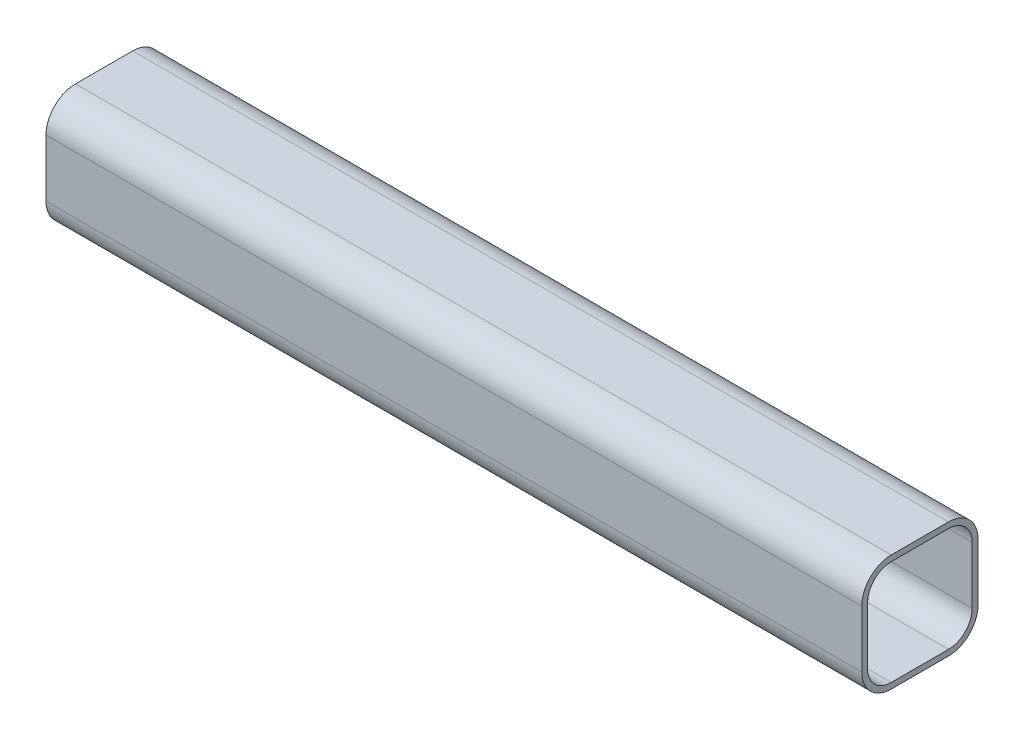
ISO-10303-21;
HEADER;
FILE_DESCRIPTION(('STEP AP214'),'2;1');
FILE_NAME('part.step','',(''),(''),'','','');
FILE_SCHEMA(('AUTOMOTIVE_DESIGN { 1 0 10303 214 1 1 1 1 }'));
ENDSEC;
DATA;
#1=APPLICATION_CONTEXT('core data for automotive mechanical design processes');
#2=APPLICATION_PROTOCOL_DEFINITION('international standard','automotive_design',2000,#1);
#3=PRODUCT_CONTEXT('',#1,'mechanical');
#4=PRODUCT('Part','Part','',(#3));
#5=PRODUCT_RELATED_PRODUCT_CATEGORY('part','',(#4));
#6=PRODUCT_DEFINITION_FORMATION('','',#4);
#7=PRODUCT_DEFINITION_CONTEXT('part definition',#1,'design');
#8=PRODUCT_DEFINITION('design','',#6,#7);
#9=PRODUCT_DEFINITION_SHAPE('','',#8);
#10=(LENGTH_UNIT() NAMED_UNIT(*) SI_UNIT(.MILLI.,.METRE.));
#11=(NAMED_UNIT(*) PLANE_ANGLE_UNIT() SI_UNIT($,.RADIAN.));
#12=(NAMED_UNIT(*) SI_UNIT($,.STERADIAN.) SOLID_ANGLE_UNIT());
#13=UNCERTAINTY_MEASURE_WITH_UNIT(LENGTH_MEASURE(1.E-05),#10,'distance_accuracy_value','');
#14=(GEOMETRIC_REPRESENTATION_CONTEXT(3) GLOBAL_UNCERTAINTY_ASSIGNED_CONTEXT((#13)) GLOBAL_UNIT_ASSIGNED_CONTEXT((#10,
#11,#12)) REPRESENTATION_CONTEXT('',''));
#15=CARTESIAN_POINT('',(0.,0.,0.));
#16=DIRECTION('',(0.,0.,1.));
#17=DIRECTION('',(1.,0.,0.));
#18=AXIS2_PLACEMENT_3D('',#15,#16,#17);
#19=CARTESIAN_POINT('',(214.786165341652,12.3,12.3));
#20=DIRECTION('',(-1.,0.,0.));
#21=DIRECTION('',(0.,0.,1.));
#22=AXIS2_PLACEMENT_3D('',#19,#20,#21);
#23=CYLINDRICAL_SURFACE('',#22,12.7);
#24=CARTESIAN_POINT('',(-136.213834658348,12.3,12.3));
#25=DIRECTION('',(1.,0.,0.));
#26=DIRECTION('',(0.,0.,-1.));
#27=AXIS2_PLACEMENT_3D('',#24,#25,#26);
#28=CIRCLE('',#27,12.7);
#29=CARTESIAN_POINT('',(-136.213834658348,25.,12.3));
#30=VERTEX_POINT('',#29);
#31=CARTESIAN_POINT('',(-136.213834658348,12.3,25.));
#32=VERTEX_POINT('',#31);
#33=EDGE_CURVE('E236',#30,#32,#28,.T.);
#34=ORIENTED_EDGE('',*,*,#33,.T.);
#35=DIRECTION('',(-1.,0.,0.));
#36=VECTOR('',#35,1.);
#37=CARTESIAN_POINT('',(214.786165341652,12.3,25.));
#38=LINE('',#37,#36);
#39=CARTESIAN_POINT('',(214.786165341652,12.3,25.));
#40=VERTEX_POINT('',#39);
#41=EDGE_CURVE('E12',#40,#32,#38,.T.);
#42=ORIENTED_EDGE('',*,*,#41,.F.);
#43=CARTESIAN_POINT('',(214.786165341652,12.3,12.3));
#44=DIRECTION('',(1.,0.,0.));
#45=DIRECTION('',(0.,0.,-1.));
#46=AXIS2_PLACEMENT_3D('',#43,#44,#45);
#47=CIRCLE('',#46,12.7);
#48=CARTESIAN_POINT('',(214.786165341652,25.,12.3));
#49=VERTEX_POINT('',#48);
#50=EDGE_CURVE('E314',#49,#40,#47,.T.);
#51=ORIENTED_EDGE('',*,*,#50,.F.);
#52=DIRECTION('',(-1.,0.,0.));
#53=VECTOR('',#52,1.);
#54=CARTESIAN_POINT('',(214.786165341652,25.,12.3));
#55=LINE('',#54,#53);
#56=EDGE_CURVE('E251',#49,#30,#55,.T.);
#57=ORIENTED_EDGE('',*,*,#56,.T.);
#58=EDGE_LOOP('',(#34,#42,#51,#57));
#59=FACE_BOUND('',#58,.T.);
#60=ADVANCED_FACE('F64',(#59),#23,.T.);
#61=CARTESIAN_POINT('',(214.786165341652,12.3,25.));
#62=DIRECTION('',(0.,0.,-1.));
#63=DIRECTION('',(-1.,0.,0.));
#64=AXIS2_PLACEMENT_3D('',#61,#62,#63);
#65=PLANE('',#64);
#66=DIRECTION('',(0.,-1.,0.));
#67=VECTOR('',#66,1.);
#68=CARTESIAN_POINT('',(-136.213834658348,12.3,25.));
#69=LINE('',#68,#67);
#70=CARTESIAN_POINT('',(-136.213834658348,-12.3,25.));
#71=VERTEX_POINT('',#70);
#72=EDGE_CURVE('E239',#32,#71,#69,.T.);
#73=ORIENTED_EDGE('',*,*,#72,.T.);
#74=DIRECTION('',(-1.,0.,0.));
#75=VECTOR('',#74,1.);
#76=CARTESIAN_POINT('',(214.786165341652,-12.3,25.));
#77=LINE('',#76,#75);
#78=CARTESIAN_POINT('',(214.786165341652,-12.3,25.));
#79=VERTEX_POINT('',#78);
#80=EDGE_CURVE('E74',#79,#71,#77,.T.);
#81=ORIENTED_EDGE('',*,*,#80,.F.);
#82=DIRECTION('',(0.,-1.,0.));
#83=VECTOR('',#82,1.);
#84=CARTESIAN_POINT('',(214.786165341652,12.3,25.));
#85=LINE('',#84,#83);
#86=EDGE_CURVE('E316',#40,#79,#85,.T.);
#87=ORIENTED_EDGE('',*,*,#86,.F.);
#88=ORIENTED_EDGE('',*,*,#41,.T.);
#89=EDGE_LOOP('',(#73,#81,#87,#88));
#90=FACE_BOUND('',#89,.T.);
#91=ADVANCED_FACE('F351',(#90),#65,.F.);
#92=CARTESIAN_POINT('',(214.786165341652,-12.3,12.3));
#93=DIRECTION('',(-1.,0.,0.));
#94=DIRECTION('',(0.,0.,1.));
#95=AXIS2_PLACEMENT_3D('',#92,#93,#94);
#96=CYLINDRICAL_SURFACE('',#95,12.7);
#97=CARTESIAN_POINT('',(-136.213834658348,-12.3,12.3));
#98=DIRECTION('',(1.,0.,0.));
#99=DIRECTION('',(0.,0.,-1.));
#100=AXIS2_PLACEMENT_3D('',#97,#98,#99);
#101=CIRCLE('',#100,12.7);
#102=CARTESIAN_POINT('',(-136.213834658348,-25.,12.3));
#103=VERTEX_POINT('',#102);
#104=EDGE_CURVE('E241',#71,#103,#101,.T.);
#105=ORIENTED_EDGE('',*,*,#104,.T.);
#106=DIRECTION('',(-1.,0.,0.));
#107=VECTOR('',#106,1.);
#108=CARTESIAN_POINT('',(214.786165341652,-25.,12.3));
#109=LINE('',#108,#107);
#110=CARTESIAN_POINT('',(214.786165341652,-25.,12.3));
#111=VERTEX_POINT('',#110);
#112=EDGE_CURVE('E258',#111,#103,#109,.T.);
#113=ORIENTED_EDGE('',*,*,#112,.F.);
#114=CARTESIAN_POINT('',(214.786165341652,-12.3,12.3));
#115=DIRECTION('',(1.,0.,0.));
#116=DIRECTION('',(0.,0.,-1.));
#117=AXIS2_PLACEMENT_3D('',#114,#115,#116);
#118=CIRCLE('',#117,12.7);
#119=EDGE_CURVE('E318',#79,#111,#118,.T.);
#120=ORIENTED_EDGE('',*,*,#119,.F.);
#121=ORIENTED_EDGE('',*,*,#80,.T.);
#122=EDGE_LOOP('',(#105,#113,#120,#121));
#123=FACE_BOUND('',#122,.T.);
#124=ADVANCED_FACE('F356',(#123),#96,.T.);
#125=CARTESIAN_POINT('',(214.786165341652,-25.,-12.3));
#126=DIRECTION('',(0.,1.,0.));
#127=DIRECTION('',(0.,0.,1.));
#128=AXIS2_PLACEMENT_3D('',#125,#126,#127);
#129=PLANE('',#128);
#130=DIRECTION('',(0.,0.,-1.));
#131=VECTOR('',#130,1.);
#132=CARTESIAN_POINT('',(-136.213834658348,-25.,-12.3));
#133=LINE('',#132,#131);
#134=CARTESIAN_POINT('',(-136.213834658348,-25.,-12.3));
#135=VERTEX_POINT('',#134);
#136=EDGE_CURVE('E243',#103,#135,#133,.T.);
#137=ORIENTED_EDGE('',*,*,#136,.T.);
#138=DIRECTION('',(-1.,0.,0.));
#139=VECTOR('',#138,1.);
#140=CARTESIAN_POINT('',(214.786165341652,-25.,-12.3));
#141=LINE('',#140,#139);
#142=CARTESIAN_POINT('',(214.786165341652,-25.,-12.3));
#143=VERTEX_POINT('',#142);
#144=EDGE_CURVE('E255',#143,#135,#141,.T.);
#145=ORIENTED_EDGE('',*,*,#144,.F.);
#146=DIRECTION('',(0.,0.,-1.));
#147=VECTOR('',#146,1.);
#148=CARTESIAN_POINT('',(214.786165341652,-25.,-12.3));
#149=LINE('',#148,#147);
#150=EDGE_CURVE('E320',#111,#143,#149,.T.);
#151=ORIENTED_EDGE('',*,*,#150,.F.);
#152=ORIENTED_EDGE('',*,*,#112,.T.);
#153=EDGE_LOOP('',(#137,#145,#151,#152));
#154=FACE_BOUND('',#153,.T.);
#155=ADVANCED_FACE('F326',(#154),#129,.F.);
#156=CARTESIAN_POINT('',(214.786165341652,-12.3,-12.3));
#157=DIRECTION('',(-1.,0.,0.));
#158=DIRECTION('',(0.,0.,1.));
#159=AXIS2_PLACEMENT_3D('',#156,#157,#158);
#160=CYLINDRICAL_SURFACE('',#159,12.7);
#161=CARTESIAN_POINT('',(-136.213834658348,-12.3,-12.3));
#162=DIRECTION('',(1.,0.,0.));
#163=DIRECTION('',(0.,0.,-1.));
#164=AXIS2_PLACEMENT_3D('',#161,#162,#163);
#165=CIRCLE('',#164,12.7);
#166=CARTESIAN_POINT('',(-136.213834658348,-12.3,-25.));
#167=VERTEX_POINT('',#166);
#168=EDGE_CURVE('E245',#135,#167,#165,.T.);
#169=ORIENTED_EDGE('',*,*,#168,.T.);
#170=DIRECTION('',(-1.,0.,0.));
#171=VECTOR('',#170,1.);
#172=CARTESIAN_POINT('',(214.786165341652,-12.3,-25.));
#173=LINE('',#172,#171);
#174=CARTESIAN_POINT('',(214.786165341652,-12.3,-25.));
#175=VERTEX_POINT('',#174);
#176=EDGE_CURVE('E203',#175,#167,#173,.T.);
#177=ORIENTED_EDGE('',*,*,#176,.F.);
#178=CARTESIAN_POINT('',(214.786165341652,-12.3,-12.3));
#179=DIRECTION('',(1.,0.,0.));
#180=DIRECTION('',(0.,0.,-1.));
#181=AXIS2_PLACEMENT_3D('',#178,#179,#180);
#182=CIRCLE('',#181,12.7);
#183=EDGE_CURVE('E194',#143,#175,#182,.T.);
#184=ORIENTED_EDGE('',*,*,#183,.F.);
#185=ORIENTED_EDGE('',*,*,#144,.T.);
#186=EDGE_LOOP('',(#169,#177,#184,#185));
#187=FACE_BOUND('',#186,.T.);
#188=ADVANCED_FACE('F330',(#187),#160,.T.);
#189=CARTESIAN_POINT('',(214.786165341652,-12.3,-25.));
#190=DIRECTION('',(0.,0.,1.));
#191=DIRECTION('',(1.,0.,0.));
#192=AXIS2_PLACEMENT_3D('',#189,#190,#191);
#193=PLANE('',#192);
#194=DIRECTION('',(0.,1.,0.));
#195=VECTOR('',#194,1.);
#196=CARTESIAN_POINT('',(-136.213834658348,-12.3,-25.));
#197=LINE('',#196,#195);
#198=CARTESIAN_POINT('',(-136.213834658348,12.3,-25.));
#199=VERTEX_POINT('',#198);
#200=EDGE_CURVE('E202',#167,#199,#197,.T.);
#201=ORIENTED_EDGE('',*,*,#200,.T.);
#202=DIRECTION('',(-1.,0.,0.));
#203=VECTOR('',#202,1.);
#204=CARTESIAN_POINT('',(214.786165341652,12.3,-25.));
#205=LINE('',#204,#203);
#206=CARTESIAN_POINT('',(214.786165341652,12.3,-25.));
#207=VERTEX_POINT('',#206);
#208=EDGE_CURVE('E199',#207,#199,#205,.T.);
#209=ORIENTED_EDGE('',*,*,#208,.F.);
#210=DIRECTION('',(0.,1.,0.));
#211=VECTOR('',#210,1.);
#212=CARTESIAN_POINT('',(214.786165341652,-12.3,-25.));
#213=LINE('',#212,#211);
#214=EDGE_CURVE('E188',#175,#207,#213,.T.);
#215=ORIENTED_EDGE('',*,*,#214,.F.);
#216=ORIENTED_EDGE('',*,*,#176,.T.);
#217=EDGE_LOOP('',(#201,#209,#215,#216));
#218=FACE_BOUND('',#217,.T.);
#219=ADVANCED_FACE('F200',(#218),#193,.F.);
#220=CARTESIAN_POINT('',(214.786165341652,12.3,-12.3));
#221=DIRECTION('',(-1.,0.,0.));
#222=DIRECTION('',(0.,0.,1.));
#223=AXIS2_PLACEMENT_3D('',#220,#221,#222);
#224=CYLINDRICAL_SURFACE('',#223,12.7);
#225=CARTESIAN_POINT('',(-136.213834658348,12.3,-12.3));
#226=DIRECTION('',(1.,0.,0.));
#227=DIRECTION('',(0.,0.,-1.));
#228=AXIS2_PLACEMENT_3D('',#225,#226,#227);
#229=CIRCLE('',#228,12.7);
#230=CARTESIAN_POINT('',(-136.213834658348,25.,-12.3));
#231=VERTEX_POINT('',#230);
#232=EDGE_CURVE('E136',#199,#231,#229,.T.);
#233=ORIENTED_EDGE('',*,*,#232,.T.);
#234=DIRECTION('',(-1.,0.,0.));
#235=VECTOR('',#234,1.);
#236=CARTESIAN_POINT('',(214.786165341652,25.,-12.3));
#237=LINE('',#236,#235);
#238=CARTESIAN_POINT('',(214.786165341652,25.,-12.3));
#239=VERTEX_POINT('',#238);
#240=EDGE_CURVE('E204',#239,#231,#237,.T.);
#241=ORIENTED_EDGE('',*,*,#240,.F.);
#242=CARTESIAN_POINT('',(214.786165341652,12.3,-12.3));
#243=DIRECTION('',(1.,0.,0.));
#244=DIRECTION('',(0.,0.,-1.));
#245=AXIS2_PLACEMENT_3D('',#242,#243,#244);
#246=CIRCLE('',#245,12.7);
#247=EDGE_CURVE('E192',#207,#239,#246,.T.);
#248=ORIENTED_EDGE('',*,*,#247,.F.);
#249=ORIENTED_EDGE('',*,*,#208,.T.);
#250=EDGE_LOOP('',(#233,#241,#248,#249));
#251=FACE_BOUND('',#250,.T.);
#252=ADVANCED_FACE('F206',(#251),#224,.T.);
#253=CARTESIAN_POINT('',(214.786165341652,-12.3,12.3));
#254=DIRECTION('',(-1.,0.,0.));
#255=DIRECTION('',(0.,0.,1.));
#256=AXIS2_PLACEMENT_3D('',#253,#254,#255);
#257=CYLINDRICAL_SURFACE('',#256,10.2);
#258=CARTESIAN_POINT('',(-136.213834658348,-12.3,12.3));
#259=DIRECTION('',(1.,0.,0.));
#260=DIRECTION('',(0.,0.,-1.));
#261=AXIS2_PLACEMENT_3D('',#258,#259,#260);
#262=CIRCLE('',#261,10.2);
#263=CARTESIAN_POINT('',(-136.213834658348,-12.3,22.5));
#264=VERTEX_POINT('',#263);
#265=CARTESIAN_POINT('',(-136.213834658348,-22.5,12.3));
#266=VERTEX_POINT('',#265);
#267=EDGE_CURVE('E212',#264,#266,#262,.T.);
#268=ORIENTED_EDGE('',*,*,#267,.F.);
#269=DIRECTION('',(-1.,0.,0.));
#270=VECTOR('',#269,1.);
#271=CARTESIAN_POINT('',(214.786165341652,-12.3,22.5));
#272=LINE('',#271,#270);
#273=CARTESIAN_POINT('',(214.786165341652,-12.3,22.5));
#274=VERTEX_POINT('',#273);
#275=EDGE_CURVE('E68',#274,#264,#272,.T.);
#276=ORIENTED_EDGE('',*,*,#275,.F.);
#277=CARTESIAN_POINT('',(214.786165341652,-12.3,12.3));
#278=DIRECTION('',(1.,0.,0.));
#279=DIRECTION('',(0.,0.,-1.));
#280=AXIS2_PLACEMENT_3D('',#277,#278,#279);
#281=CIRCLE('',#280,10.2);
#282=CARTESIAN_POINT('',(214.786165341652,-22.5,12.3));
#283=VERTEX_POINT('',#282);
#284=EDGE_CURVE('E250',#274,#283,#281,.T.);
#285=ORIENTED_EDGE('',*,*,#284,.T.);
#286=DIRECTION('',(-1.,0.,0.));
#287=VECTOR('',#286,1.);
#288=CARTESIAN_POINT('',(214.786165341652,-22.5,12.3));
#289=LINE('',#288,#287);
#290=EDGE_CURVE('E208',#283,#266,#289,.T.);
#291=ORIENTED_EDGE('',*,*,#290,.T.);
#292=EDGE_LOOP('',(#268,#276,#285,#291));
#293=FACE_BOUND('',#292,.T.);
#294=ADVANCED_FACE('F66',(#293),#257,.F.);
#295=CARTESIAN_POINT('',(214.786165341652,12.3,22.5));
#296=DIRECTION('',(0.,0.,-1.));
#297=DIRECTION('',(-1.,0.,0.));
#298=AXIS2_PLACEMENT_3D('',#295,#296,#297);
#299=PLANE('',#298);
#300=DIRECTION('',(0.,-1.,0.));
#301=VECTOR('',#300,1.);
#302=CARTESIAN_POINT('',(-136.213834658348,12.3,22.5));
#303=LINE('',#302,#301);
#304=CARTESIAN_POINT('',(-136.213834658348,12.3,22.5));
#305=VERTEX_POINT('',#304);
#306=EDGE_CURVE('E215',#305,#264,#303,.T.);
#307=ORIENTED_EDGE('',*,*,#306,.F.);
#308=DIRECTION('',(-1.,0.,0.));
#309=VECTOR('',#308,1.);
#310=CARTESIAN_POINT('',(214.786165341652,12.3,22.5));
#311=LINE('',#310,#309);
#312=CARTESIAN_POINT('',(214.786165341652,12.3,22.5));
#313=VERTEX_POINT('',#312);
#314=EDGE_CURVE('E273',#313,#305,#311,.T.);
#315=ORIENTED_EDGE('',*,*,#314,.F.);
#316=DIRECTION('',(0.,-1.,0.));
#317=VECTOR('',#316,1.);
#318=CARTESIAN_POINT('',(214.786165341652,12.3,22.5));
#319=LINE('',#318,#317);
#320=EDGE_CURVE('E282',#313,#274,#319,.T.);
#321=ORIENTED_EDGE('',*,*,#320,.T.);
#322=ORIENTED_EDGE('',*,*,#275,.T.);
#323=EDGE_LOOP('',(#307,#315,#321,#322));
#324=FACE_BOUND('',#323,.T.);
#325=ADVANCED_FACE('F280',(#324),#299,.T.);
#326=CARTESIAN_POINT('',(214.786165341652,12.3,12.3));
#327=DIRECTION('',(-1.,0.,0.));
#328=DIRECTION('',(0.,0.,1.));
#329=AXIS2_PLACEMENT_3D('',#326,#327,#328);
#330=CYLINDRICAL_SURFACE('',#329,10.2);
#331=CARTESIAN_POINT('',(-136.213834658348,12.3,12.3));
#332=DIRECTION('',(1.,0.,0.));
#333=DIRECTION('',(0.,0.,-1.));
#334=AXIS2_PLACEMENT_3D('',#331,#332,#333);
#335=CIRCLE('',#334,10.2);
#336=CARTESIAN_POINT('',(-136.213834658348,22.5,12.3));
#337=VERTEX_POINT('',#336);
#338=EDGE_CURVE('E218',#337,#305,#335,.T.);
#339=ORIENTED_EDGE('',*,*,#338,.F.);
#340=DIRECTION('',(-1.,0.,0.));
#341=VECTOR('',#340,1.);
#342=CARTESIAN_POINT('',(214.786165341652,22.5,12.3));
#343=LINE('',#342,#341);
#344=CARTESIAN_POINT('',(214.786165341652,22.5,12.3));
#345=VERTEX_POINT('',#344);
#346=EDGE_CURVE('E272',#345,#337,#343,.T.);
#347=ORIENTED_EDGE('',*,*,#346,.F.);
#348=CARTESIAN_POINT('',(214.786165341652,12.3,12.3));
#349=DIRECTION('',(1.,0.,0.));
#350=DIRECTION('',(0.,0.,-1.));
#351=AXIS2_PLACEMENT_3D('',#348,#349,#350);
#352=CIRCLE('',#351,10.2);
#353=EDGE_CURVE('E290',#345,#313,#352,.T.);
#354=ORIENTED_EDGE('',*,*,#353,.T.);
#355=ORIENTED_EDGE('',*,*,#314,.T.);
#356=EDGE_LOOP('',(#339,#347,#354,#355));
#357=FACE_BOUND('',#356,.T.);
#358=ADVANCED_FACE('F288',(#357),#330,.F.);
#359=CARTESIAN_POINT('',(214.786165341652,22.5,12.3));
#360=DIRECTION('',(0.,-1.,0.));
#361=DIRECTION('',(0.,0.,-1.));
#362=AXIS2_PLACEMENT_3D('',#359,#360,#361);
#363=PLANE('',#362);
#364=DIRECTION('',(0.,0.,1.));
#365=VECTOR('',#364,1.);
#366=CARTESIAN_POINT('',(-136.213834658348,22.5,12.3));
#367=LINE('',#366,#365);
#368=CARTESIAN_POINT('',(-136.213834658348,22.5,-12.3));
#369=VERTEX_POINT('',#368);
#370=EDGE_CURVE('E221',#369,#337,#367,.T.);
#371=ORIENTED_EDGE('',*,*,#370,.F.);
#372=DIRECTION('',(-1.,0.,0.));
#373=VECTOR('',#372,1.);
#374=CARTESIAN_POINT('',(214.786165341652,22.5,-12.3));
#375=LINE('',#374,#373);
#376=CARTESIAN_POINT('',(214.786165341652,22.5,-12.3));
#377=VERTEX_POINT('',#376);
#378=EDGE_CURVE('E270',#377,#369,#375,.T.);
#379=ORIENTED_EDGE('',*,*,#378,.F.);
#380=DIRECTION('',(0.,0.,1.));
#381=VECTOR('',#380,1.);
#382=CARTESIAN_POINT('',(214.786165341652,22.5,12.3));
#383=LINE('',#382,#381);
#384=EDGE_CURVE('E296',#377,#345,#383,.T.);
#385=ORIENTED_EDGE('',*,*,#384,.T.);
#386=ORIENTED_EDGE('',*,*,#346,.T.);
#387=EDGE_LOOP('',(#371,#379,#385,#386));
#388=FACE_BOUND('',#387,.T.);
#389=ADVANCED_FACE('F299',(#388),#363,.T.);
#390=CARTESIAN_POINT('',(214.786165341652,12.3,-12.3));
#391=DIRECTION('',(-1.,0.,0.));
#392=DIRECTION('',(0.,0.,1.));
#393=AXIS2_PLACEMENT_3D('',#390,#391,#392);
#394=CYLINDRICAL_SURFACE('',#393,10.2);
#395=CARTESIAN_POINT('',(-136.213834658348,12.3,-12.3));
#396=DIRECTION('',(1.,0.,0.));
#397=DIRECTION('',(0.,0.,-1.));
#398=AXIS2_PLACEMENT_3D('',#395,#396,#397);
#399=CIRCLE('',#398,10.2);
#400=CARTESIAN_POINT('',(-136.213834658348,12.3,-22.5));
#401=VERTEX_POINT('',#400);
#402=EDGE_CURVE('E224',#401,#369,#399,.T.);
#403=ORIENTED_EDGE('',*,*,#402,.F.);
#404=DIRECTION('',(-1.,0.,0.));
#405=VECTOR('',#404,1.);
#406=CARTESIAN_POINT('',(214.786165341652,12.3,-22.5));
#407=LINE('',#406,#405);
#408=CARTESIAN_POINT('',(214.786165341652,12.3,-22.5));
#409=VERTEX_POINT('',#408);
#410=EDGE_CURVE('E268',#409,#401,#407,.T.);
#411=ORIENTED_EDGE('',*,*,#410,.F.);
#412=CARTESIAN_POINT('',(214.786165341652,12.3,-12.3));
#413=DIRECTION('',(1.,0.,0.));
#414=DIRECTION('',(0.,0.,-1.));
#415=AXIS2_PLACEMENT_3D('',#412,#413,#414);
#416=CIRCLE('',#415,10.2);
#417=EDGE_CURVE('E300',#409,#377,#416,.T.);
#418=ORIENTED_EDGE('',*,*,#417,.T.);
#419=ORIENTED_EDGE('',*,*,#378,.T.);
#420=EDGE_LOOP('',(#403,#411,#418,#419));
#421=FACE_BOUND('',#420,.T.);
#422=ADVANCED_FACE('F367',(#421),#394,.F.);
#423=CARTESIAN_POINT('',(214.786165341652,-12.3,-22.5));
#424=DIRECTION('',(0.,0.,1.));
#425=DIRECTION('',(1.,0.,0.));
#426=AXIS2_PLACEMENT_3D('',#423,#424,#425);
#427=PLANE('',#426);
#428=DIRECTION('',(0.,1.,0.));
#429=VECTOR('',#428,1.);
#430=CARTESIAN_POINT('',(-136.213834658348,-12.3,-22.5));
#431=LINE('',#430,#429);
#432=CARTESIAN_POINT('',(-136.213834658348,-12.3,-22.5));
#433=VERTEX_POINT('',#432);
#434=EDGE_CURVE('E227',#433,#401,#431,.T.);
#435=ORIENTED_EDGE('',*,*,#434,.F.);
#436=DIRECTION('',(-1.,0.,0.));
#437=VECTOR('',#436,1.);
#438=CARTESIAN_POINT('',(214.786165341652,-12.3,-22.5));
#439=LINE('',#438,#437);
#440=CARTESIAN_POINT('',(214.786165341652,-12.3,-22.5));
#441=VERTEX_POINT('',#440);
#442=EDGE_CURVE('E266',#441,#433,#439,.T.);
#443=ORIENTED_EDGE('',*,*,#442,.F.);
#444=DIRECTION('',(0.,1.,0.));
#445=VECTOR('',#444,1.);
#446=CARTESIAN_POINT('',(214.786165341652,-12.3,-22.5));
#447=LINE('',#446,#445);
#448=EDGE_CURVE('E302',#441,#409,#447,.T.);
#449=ORIENTED_EDGE('',*,*,#448,.T.);
#450=ORIENTED_EDGE('',*,*,#410,.T.);
#451=EDGE_LOOP('',(#435,#443,#449,#450));
#452=FACE_BOUND('',#451,.T.);
#453=ADVANCED_FACE('F363',(#452),#427,.T.);
#454=CARTESIAN_POINT('',(214.786165341652,-12.3,-12.3));
#455=DIRECTION('',(-1.,0.,0.));
#456=DIRECTION('',(0.,0.,1.));
#457=AXIS2_PLACEMENT_3D('',#454,#455,#456);
#458=CYLINDRICAL_SURFACE('',#457,10.2);
#459=CARTESIAN_POINT('',(-136.213834658348,-12.3,-12.3));
#460=DIRECTION('',(1.,0.,0.));
#461=DIRECTION('',(0.,0.,-1.));
#462=AXIS2_PLACEMENT_3D('',#459,#460,#461);
#463=CIRCLE('',#462,10.2);
#464=CARTESIAN_POINT('',(-136.213834658348,-22.5,-12.3));
#465=VERTEX_POINT('',#464);
#466=EDGE_CURVE('E230',#465,#433,#463,.T.);
#467=ORIENTED_EDGE('',*,*,#466,.F.);
#468=DIRECTION('',(-1.,0.,0.));
#469=VECTOR('',#468,1.);
#470=CARTESIAN_POINT('',(214.786165341652,-22.5,-12.3));
#471=LINE('',#470,#469);
#472=CARTESIAN_POINT('',(214.786165341652,-22.5,-12.3));
#473=VERTEX_POINT('',#472);
#474=EDGE_CURVE('E264',#473,#465,#471,.T.);
#475=ORIENTED_EDGE('',*,*,#474,.F.);
#476=CARTESIAN_POINT('',(214.786165341652,-12.3,-12.3));
#477=DIRECTION('',(1.,0.,0.));
#478=DIRECTION('',(0.,0.,-1.));
#479=AXIS2_PLACEMENT_3D('',#476,#477,#478);
#480=CIRCLE('',#479,10.2);
#481=EDGE_CURVE('E308',#473,#441,#480,.T.);
#482=ORIENTED_EDGE('',*,*,#481,.T.);
#483=ORIENTED_EDGE('',*,*,#442,.T.);
#484=EDGE_LOOP('',(#467,#475,#482,#483));
#485=FACE_BOUND('',#484,.T.);
#486=ADVANCED_FACE('F345',(#485),#458,.F.);
#487=CARTESIAN_POINT('',(214.786165341652,-22.5,-12.3));
#488=DIRECTION('',(0.,1.,0.));
#489=DIRECTION('',(0.,0.,1.));
#490=AXIS2_PLACEMENT_3D('',#487,#488,#489);
#491=PLANE('',#490);
#492=DIRECTION('',(0.,0.,-1.));
#493=VECTOR('',#492,1.);
#494=CARTESIAN_POINT('',(-136.213834658348,-22.5,-12.3));
#495=LINE('',#494,#493);
#496=EDGE_CURVE('E233',#266,#465,#495,.T.);
#497=ORIENTED_EDGE('',*,*,#496,.F.);
#498=ORIENTED_EDGE('',*,*,#290,.F.);
#499=DIRECTION('',(0.,0.,-1.));
#500=VECTOR('',#499,1.);
#501=CARTESIAN_POINT('',(214.786165341652,-22.5,-12.3));
#502=LINE('',#501,#500);
#503=EDGE_CURVE('E311',#283,#473,#502,.T.);
#504=ORIENTED_EDGE('',*,*,#503,.T.);
#505=ORIENTED_EDGE('',*,*,#474,.T.);
#506=EDGE_LOOP('',(#497,#498,#504,#505));
#507=FACE_BOUND('',#506,.T.);
#508=ADVANCED_FACE('F338',(#507),#491,.T.);
#509=CARTESIAN_POINT('',(214.786165341652,25.,12.3));
#510=DIRECTION('',(0.,-1.,0.));
#511=DIRECTION('',(0.,0.,-1.));
#512=AXIS2_PLACEMENT_3D('',#509,#510,#511);
#513=PLANE('',#512);
#514=DIRECTION('',(0.,0.,1.));
#515=VECTOR('',#514,1.);
#516=CARTESIAN_POINT('',(-136.213834658348,25.,12.3));
#517=LINE('',#516,#515);
#518=EDGE_CURVE('E142',#231,#30,#517,.T.);
#519=ORIENTED_EDGE('',*,*,#518,.T.);
#520=ORIENTED_EDGE('',*,*,#56,.F.);
#521=DIRECTION('',(0.,0.,1.));
#522=VECTOR('',#521,1.);
#523=CARTESIAN_POINT('',(214.786165341652,25.,12.3));
#524=LINE('',#523,#522);
#525=EDGE_CURVE('E83',#239,#49,#524,.T.);
#526=ORIENTED_EDGE('',*,*,#525,.F.);
#527=ORIENTED_EDGE('',*,*,#240,.T.);
#528=EDGE_LOOP('',(#519,#520,#526,#527));
#529=FACE_BOUND('',#528,.T.);
#530=ADVANCED_FACE('F336',(#529),#513,.F.);
#531=CARTESIAN_POINT('',(214.786165341652,12.3,12.3));
#532=DIRECTION('',(1.,0.,0.));
#533=DIRECTION('',(0.,0.,-1.));
#534=AXIS2_PLACEMENT_3D('',#531,#532,#533);
#535=PLANE('',#534);
#536=ORIENTED_EDGE('',*,*,#284,.F.);
#537=ORIENTED_EDGE('',*,*,#320,.F.);
#538=ORIENTED_EDGE('',*,*,#353,.F.);
#539=ORIENTED_EDGE('',*,*,#384,.F.);
#540=ORIENTED_EDGE('',*,*,#417,.F.);
#541=ORIENTED_EDGE('',*,*,#448,.F.);
#542=ORIENTED_EDGE('',*,*,#481,.F.);
#543=ORIENTED_EDGE('',*,*,#503,.F.);
#544=EDGE_LOOP('',(#536,#537,#538,#539,#540,#541,#542,#543));
#545=FACE_BOUND('',#544,.T.);
#546=ORIENTED_EDGE('',*,*,#50,.T.);
#547=ORIENTED_EDGE('',*,*,#86,.T.);
#548=ORIENTED_EDGE('',*,*,#119,.T.);
#549=ORIENTED_EDGE('',*,*,#150,.T.);
#550=ORIENTED_EDGE('',*,*,#183,.T.);
#551=ORIENTED_EDGE('',*,*,#214,.T.);
#552=ORIENTED_EDGE('',*,*,#247,.T.);
#553=ORIENTED_EDGE('',*,*,#525,.T.);
#554=EDGE_LOOP('',(#546,#547,#548,#549,#550,#551,#552,#553));
#555=FACE_BOUND('',#554,.T.);
#556=ADVANCED_FACE('F190',(#545,#555),#535,.T.);
#557=CARTESIAN_POINT('',(-136.213834658348,12.3,12.3));
#558=DIRECTION('',(1.,0.,0.));
#559=DIRECTION('',(0.,0.,-1.));
#560=AXIS2_PLACEMENT_3D('',#557,#558,#559);
#561=PLANE('',#560);
#562=ORIENTED_EDGE('',*,*,#267,.T.);
#563=ORIENTED_EDGE('',*,*,#496,.T.);
#564=ORIENTED_EDGE('',*,*,#466,.T.);
#565=ORIENTED_EDGE('',*,*,#434,.T.);
#566=ORIENTED_EDGE('',*,*,#402,.T.);
#567=ORIENTED_EDGE('',*,*,#370,.T.);
#568=ORIENTED_EDGE('',*,*,#338,.T.);
#569=ORIENTED_EDGE('',*,*,#306,.T.);
#570=EDGE_LOOP('',(#562,#563,#564,#565,#566,#567,#568,#569));
#571=FACE_BOUND('',#570,.T.);
#572=ORIENTED_EDGE('',*,*,#33,.F.);
#573=ORIENTED_EDGE('',*,*,#518,.F.);
#574=ORIENTED_EDGE('',*,*,#232,.F.);
#575=ORIENTED_EDGE('',*,*,#200,.F.);
#576=ORIENTED_EDGE('',*,*,#168,.F.);
#577=ORIENTED_EDGE('',*,*,#136,.F.);
#578=ORIENTED_EDGE('',*,*,#104,.F.);
#579=ORIENTED_EDGE('',*,*,#72,.F.);
#580=EDGE_LOOP('',(#572,#573,#574,#575,#576,#577,#578,#579));
#581=FACE_BOUND('',#580,.T.);
#582=ADVANCED_FACE('F285',(#571,#581),#561,.F.);
#583=CLOSED_SHELL('',(#60,#91,#124,#155,#188,#219,#252,#294,#325,#358,#389,#422,#453,#486,#508,
#530,#556,#582));
#584=MANIFOLD_SOLID_BREP('B2',#583);
#585=ADVANCED_BREP_SHAPE_REPRESENTATION('',(#18,#584),#14);
#586=SHAPE_DEFINITION_REPRESENTATION(#9,#585);
ENDSEC;
END-ISO-10303-21;
